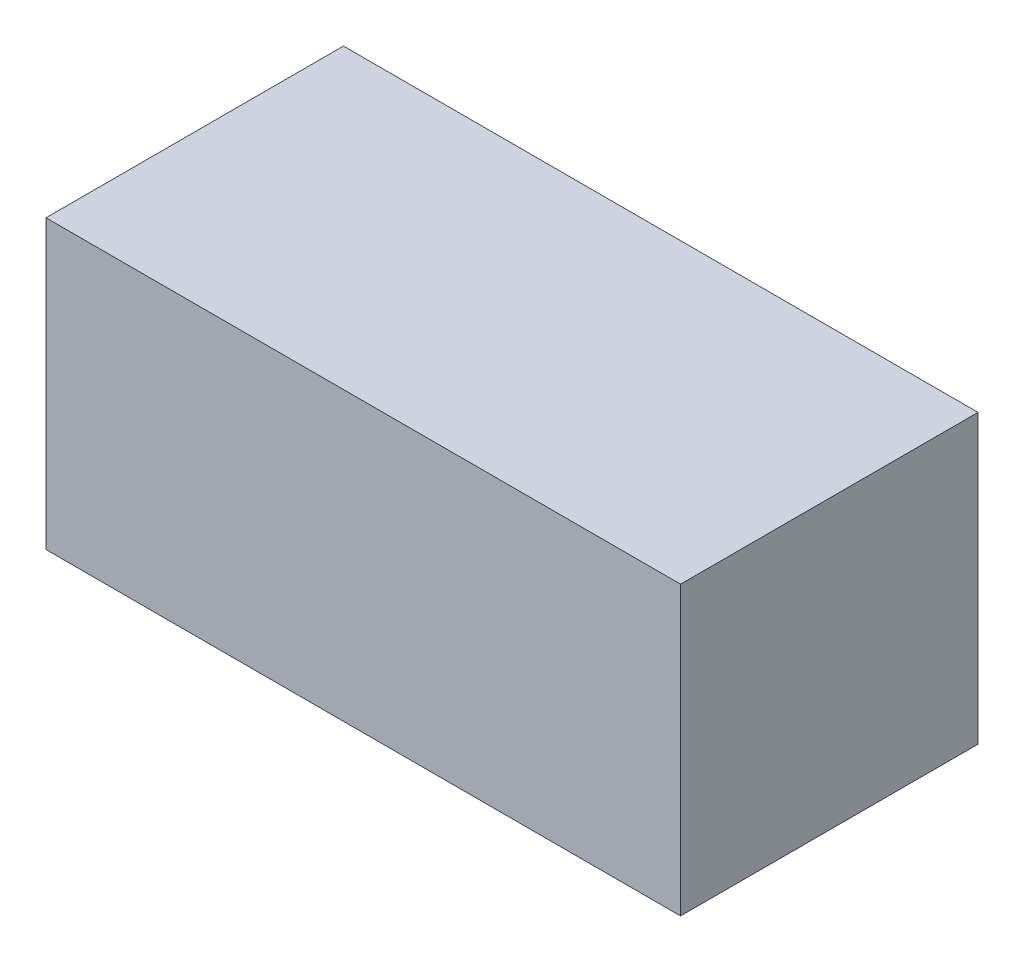
ISO-10303-21;
HEADER;
FILE_DESCRIPTION(('STEP AP214'),'2;1');
FILE_NAME('part.step','',(''),(''),'','','');
FILE_SCHEMA(('AUTOMOTIVE_DESIGN { 1 0 10303 214 1 1 1 1 }'));
ENDSEC;
DATA;
#1=APPLICATION_CONTEXT('core data for automotive mechanical design processes');
#2=APPLICATION_PROTOCOL_DEFINITION('international standard','automotive_design',2000,#1);
#3=PRODUCT_CONTEXT('',#1,'mechanical');
#4=PRODUCT('Part','Part','',(#3));
#5=PRODUCT_RELATED_PRODUCT_CATEGORY('part','',(#4));
#6=PRODUCT_DEFINITION_FORMATION('','',#4);
#7=PRODUCT_DEFINITION_CONTEXT('part definition',#1,'design');
#8=PRODUCT_DEFINITION('design','',#6,#7);
#9=PRODUCT_DEFINITION_SHAPE('','',#8);
#10=(LENGTH_UNIT() NAMED_UNIT(*) SI_UNIT(.MILLI.,.METRE.));
#11=(NAMED_UNIT(*) PLANE_ANGLE_UNIT() SI_UNIT($,.RADIAN.));
#12=(NAMED_UNIT(*) SI_UNIT($,.STERADIAN.) SOLID_ANGLE_UNIT());
#13=UNCERTAINTY_MEASURE_WITH_UNIT(LENGTH_MEASURE(1.E-05),#10,'distance_accuracy_value','');
#14=(GEOMETRIC_REPRESENTATION_CONTEXT(3) GLOBAL_UNCERTAINTY_ASSIGNED_CONTEXT((#13)) GLOBAL_UNIT_ASSIGNED_CONTEXT((#10,
#11,#12)) REPRESENTATION_CONTEXT('',''));
#15=CARTESIAN_POINT('',(0.,0.,0.));
#16=DIRECTION('',(0.,0.,1.));
#17=DIRECTION('',(1.,0.,0.));
#18=AXIS2_PLACEMENT_3D('',#15,#16,#17);
#19=CARTESIAN_POINT('',(-1.0666,-0.483,1.));
#20=DIRECTION('',(1.,0.,0.));
#21=DIRECTION('',(0.,0.,-1.));
#22=AXIS2_PLACEMENT_3D('',#19,#20,#21);
#23=PLANE('',#22);
#24=DIRECTION('',(0.,-1.,0.));
#25=VECTOR('',#24,1.);
#26=CARTESIAN_POINT('',(-1.0666,-0.483,0.));
#27=LINE('',#26,#25);
#28=CARTESIAN_POINT('',(-1.0666,0.483,0.));
#29=VERTEX_POINT('',#28);
#30=CARTESIAN_POINT('',(-1.0666,-0.483,0.));
#31=VERTEX_POINT('',#30);
#32=EDGE_CURVE('E95',#29,#31,#27,.T.);
#33=ORIENTED_EDGE('',*,*,#32,.T.);
#34=DIRECTION('',(0.,0.,-1.));
#35=VECTOR('',#34,1.);
#36=CARTESIAN_POINT('',(-1.0666,-0.483,1.));
#37=LINE('',#36,#35);
#38=CARTESIAN_POINT('',(-1.0666,-0.483,1.));
#39=VERTEX_POINT('',#38);
#40=EDGE_CURVE('E11',#39,#31,#37,.T.);
#41=ORIENTED_EDGE('',*,*,#40,.F.);
#42=DIRECTION('',(0.,-1.,0.));
#43=VECTOR('',#42,1.);
#44=CARTESIAN_POINT('',(-1.0666,-0.483,1.));
#45=LINE('',#44,#43);
#46=CARTESIAN_POINT('',(-1.0666,0.483,1.));
#47=VERTEX_POINT('',#46);
#48=EDGE_CURVE('E83',#47,#39,#45,.T.);
#49=ORIENTED_EDGE('',*,*,#48,.F.);
#50=DIRECTION('',(0.,0.,-1.));
#51=VECTOR('',#50,1.);
#52=CARTESIAN_POINT('',(-1.0666,0.483,1.));
#53=LINE('',#52,#51);
#54=EDGE_CURVE('E91',#47,#29,#53,.T.);
#55=ORIENTED_EDGE('',*,*,#54,.T.);
#56=EDGE_LOOP('',(#33,#41,#49,#55));
#57=FACE_BOUND('',#56,.T.);
#58=ADVANCED_FACE('F32',(#57),#23,.F.);
#59=CARTESIAN_POINT('',(1.0666,-0.483,1.));
#60=DIRECTION('',(0.,1.,0.));
#61=DIRECTION('',(0.,0.,1.));
#62=AXIS2_PLACEMENT_3D('',#59,#60,#61);
#63=PLANE('',#62);
#64=DIRECTION('',(1.,0.,0.));
#65=VECTOR('',#64,1.);
#66=CARTESIAN_POINT('',(1.0666,-0.483,0.));
#67=LINE('',#66,#65);
#68=CARTESIAN_POINT('',(1.0666,-0.483,0.));
#69=VERTEX_POINT('',#68);
#70=EDGE_CURVE('E87',#31,#69,#67,.T.);
#71=ORIENTED_EDGE('',*,*,#70,.T.);
#72=DIRECTION('',(0.,0.,-1.));
#73=VECTOR('',#72,1.);
#74=CARTESIAN_POINT('',(1.0666,-0.483,1.));
#75=LINE('',#74,#73);
#76=CARTESIAN_POINT('',(1.0666,-0.483,1.));
#77=VERTEX_POINT('',#76);
#78=EDGE_CURVE('E40',#77,#69,#75,.T.);
#79=ORIENTED_EDGE('',*,*,#78,.F.);
#80=DIRECTION('',(1.,0.,0.));
#81=VECTOR('',#80,1.);
#82=CARTESIAN_POINT('',(1.0666,-0.483,1.));
#83=LINE('',#82,#81);
#84=EDGE_CURVE('E78',#39,#77,#83,.T.);
#85=ORIENTED_EDGE('',*,*,#84,.F.);
#86=ORIENTED_EDGE('',*,*,#40,.T.);
#87=EDGE_LOOP('',(#71,#79,#85,#86));
#88=FACE_BOUND('',#87,.T.);
#89=ADVANCED_FACE('F86',(#88),#63,.F.);
#90=CARTESIAN_POINT('',(1.0666,0.483,1.));
#91=DIRECTION('',(-1.,0.,0.));
#92=DIRECTION('',(0.,0.,1.));
#93=AXIS2_PLACEMENT_3D('',#90,#91,#92);
#94=PLANE('',#93);
#95=DIRECTION('',(0.,1.,0.));
#96=VECTOR('',#95,1.);
#97=CARTESIAN_POINT('',(1.0666,0.483,0.));
#98=LINE('',#97,#96);
#99=CARTESIAN_POINT('',(1.0666,0.483,0.));
#100=VERTEX_POINT('',#99);
#101=EDGE_CURVE('E65',#69,#100,#98,.T.);
#102=ORIENTED_EDGE('',*,*,#101,.T.);
#103=DIRECTION('',(0.,0.,-1.));
#104=VECTOR('',#103,1.);
#105=CARTESIAN_POINT('',(1.0666,0.483,1.));
#106=LINE('',#105,#104);
#107=CARTESIAN_POINT('',(1.0666,0.483,1.));
#108=VERTEX_POINT('',#107);
#109=EDGE_CURVE('E88',#108,#100,#106,.T.);
#110=ORIENTED_EDGE('',*,*,#109,.F.);
#111=DIRECTION('',(0.,1.,0.));
#112=VECTOR('',#111,1.);
#113=CARTESIAN_POINT('',(1.0666,0.483,1.));
#114=LINE('',#113,#112);
#115=EDGE_CURVE('E81',#77,#108,#114,.T.);
#116=ORIENTED_EDGE('',*,*,#115,.F.);
#117=ORIENTED_EDGE('',*,*,#78,.T.);
#118=EDGE_LOOP('',(#102,#110,#116,#117));
#119=FACE_BOUND('',#118,.T.);
#120=ADVANCED_FACE('F89',(#119),#94,.F.);
#121=CARTESIAN_POINT('',(-1.0666,0.483,1.));
#122=DIRECTION('',(0.,-1.,0.));
#123=DIRECTION('',(0.,0.,-1.));
#124=AXIS2_PLACEMENT_3D('',#121,#122,#123);
#125=PLANE('',#124);
#126=DIRECTION('',(-1.,0.,0.));
#127=VECTOR('',#126,1.);
#128=CARTESIAN_POINT('',(-1.0666,0.483,0.));
#129=LINE('',#128,#127);
#130=EDGE_CURVE('E71',#100,#29,#129,.T.);
#131=ORIENTED_EDGE('',*,*,#130,.T.);
#132=ORIENTED_EDGE('',*,*,#54,.F.);
#133=DIRECTION('',(-1.,0.,0.));
#134=VECTOR('',#133,1.);
#135=CARTESIAN_POINT('',(-1.0666,0.483,1.));
#136=LINE('',#135,#134);
#137=EDGE_CURVE('E48',#108,#47,#136,.T.);
#138=ORIENTED_EDGE('',*,*,#137,.F.);
#139=ORIENTED_EDGE('',*,*,#109,.T.);
#140=EDGE_LOOP('',(#131,#132,#138,#139));
#141=FACE_BOUND('',#140,.T.);
#142=ADVANCED_FACE('F102',(#141),#125,.F.);
#143=CARTESIAN_POINT('',(0.,0.,1.));
#144=DIRECTION('',(0.,0.,-1.));
#145=DIRECTION('',(-1.,0.,0.));
#146=AXIS2_PLACEMENT_3D('',#143,#144,#145);
#147=PLANE('',#146);
#148=ORIENTED_EDGE('',*,*,#48,.T.);
#149=ORIENTED_EDGE('',*,*,#84,.T.);
#150=ORIENTED_EDGE('',*,*,#115,.T.);
#151=ORIENTED_EDGE('',*,*,#137,.T.);
#152=EDGE_LOOP('',(#148,#149,#150,#151));
#153=FACE_BOUND('',#152,.T.);
#154=ADVANCED_FACE('F79',(#153),#147,.F.);
#155=CARTESIAN_POINT('',(0.,0.,0.));
#156=DIRECTION('',(0.,0.,-1.));
#157=DIRECTION('',(-1.,0.,0.));
#158=AXIS2_PLACEMENT_3D('',#155,#156,#157);
#159=PLANE('',#158);
#160=ORIENTED_EDGE('',*,*,#32,.F.);
#161=ORIENTED_EDGE('',*,*,#130,.F.);
#162=ORIENTED_EDGE('',*,*,#101,.F.);
#163=ORIENTED_EDGE('',*,*,#70,.F.);
#164=EDGE_LOOP('',(#160,#161,#162,#163));
#165=FACE_BOUND('',#164,.T.);
#166=ADVANCED_FACE('F105',(#165),#159,.T.);
#167=CLOSED_SHELL('',(#58,#89,#120,#142,#154,#166));
#168=MANIFOLD_SOLID_BREP('B2',#167);
#169=ADVANCED_BREP_SHAPE_REPRESENTATION('',(#18,#168),#14);
#170=SHAPE_DEFINITION_REPRESENTATION(#9,#169);
ENDSEC;
END-ISO-10303-21;
